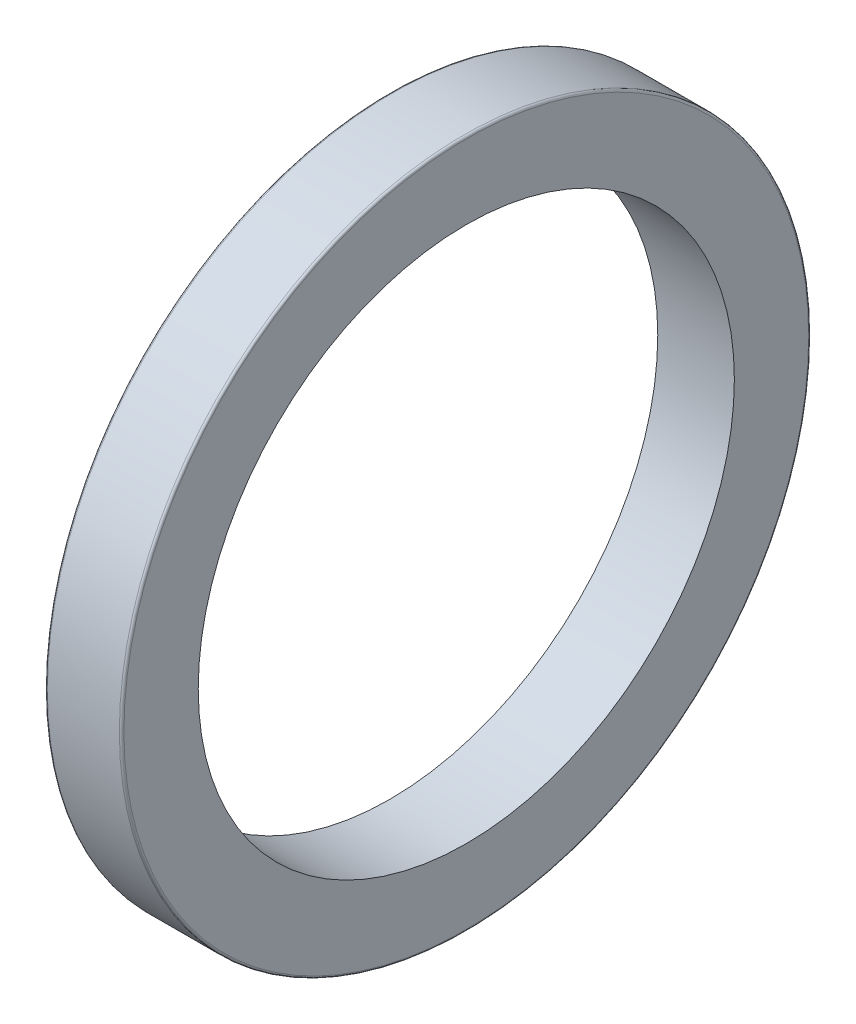
ISO-10303-21;
HEADER;
FILE_DESCRIPTION(('STEP AP214'),'2;1');
FILE_NAME('part.step','',(''),(''),'','','');
FILE_SCHEMA(('AUTOMOTIVE_DESIGN { 1 0 10303 214 1 1 1 1 }'));
ENDSEC;
DATA;
#1=APPLICATION_CONTEXT('core data for automotive mechanical design processes');
#2=APPLICATION_PROTOCOL_DEFINITION('international standard','automotive_design',2000,#1);
#3=PRODUCT_CONTEXT('',#1,'mechanical');
#4=PRODUCT('Part','Part','',(#3));
#5=PRODUCT_RELATED_PRODUCT_CATEGORY('part','',(#4));
#6=PRODUCT_DEFINITION_FORMATION('','',#4);
#7=PRODUCT_DEFINITION_CONTEXT('part definition',#1,'design');
#8=PRODUCT_DEFINITION('design','',#6,#7);
#9=PRODUCT_DEFINITION_SHAPE('','',#8);
#10=(LENGTH_UNIT() NAMED_UNIT(*) SI_UNIT(.MILLI.,.METRE.));
#11=(NAMED_UNIT(*) PLANE_ANGLE_UNIT() SI_UNIT($,.RADIAN.));
#12=(NAMED_UNIT(*) SI_UNIT($,.STERADIAN.) SOLID_ANGLE_UNIT());
#13=UNCERTAINTY_MEASURE_WITH_UNIT(LENGTH_MEASURE(1.E-05),#10,'distance_accuracy_value','');
#14=(GEOMETRIC_REPRESENTATION_CONTEXT(3) GLOBAL_UNCERTAINTY_ASSIGNED_CONTEXT((#13)) GLOBAL_UNIT_ASSIGNED_CONTEXT((#10,
#11,#12)) REPRESENTATION_CONTEXT('',''));
#15=CARTESIAN_POINT('',(0.,0.,0.));
#16=DIRECTION('',(0.,0.,1.));
#17=DIRECTION('',(1.,0.,0.));
#18=AXIS2_PLACEMENT_3D('',#15,#16,#17);
#19=CARTESIAN_POINT('',(9.7,0.,0.));
#20=DIRECTION('',(-1.,0.,0.));
#21=DIRECTION('',(0.,0.,1.));
#22=AXIS2_PLACEMENT_3D('',#19,#20,#21);
#23=TOROIDAL_SURFACE('',#22,44.7,0.300000000000004);
#24=CARTESIAN_POINT('',(10.,0.,0.));
#25=DIRECTION('',(-1.,0.,0.));
#26=DIRECTION('',(0.,0.,1.));
#27=AXIS2_PLACEMENT_3D('',#24,#25,#26);
#28=CIRCLE('',#27,44.7);
#29=CARTESIAN_POINT('',(10.,0.,-44.7));
#30=VERTEX_POINT('',#29);
#31=EDGE_CURVE('E11',#30,#30,#28,.T.);
#32=ORIENTED_EDGE('',*,*,#31,.T.);
#33=EDGE_LOOP('',(#32));
#34=FACE_BOUND('',#33,.T.);
#35=CARTESIAN_POINT('',(9.7,0.,0.));
#36=DIRECTION('',(1.,0.,0.));
#37=DIRECTION('',(0.,0.,1.));
#38=AXIS2_PLACEMENT_3D('',#35,#36,#37);
#39=CIRCLE('',#38,45.);
#40=CARTESIAN_POINT('',(9.7,0.,-45.));
#41=VERTEX_POINT('',#40);
#42=EDGE_CURVE('E28',#41,#41,#39,.T.);
#43=ORIENTED_EDGE('',*,*,#42,.T.);
#44=EDGE_LOOP('',(#43));
#45=FACE_BOUND('',#44,.T.);
#46=ADVANCED_FACE('F17',(#34,#45),#23,.T.);
#47=CARTESIAN_POINT('',(5.,0.,0.));
#48=DIRECTION('',(1.,0.,0.));
#49=DIRECTION('',(0.,0.,1.));
#50=AXIS2_PLACEMENT_3D('',#47,#48,#49);
#51=CYLINDRICAL_SURFACE('',#50,45.);
#52=CARTESIAN_POINT('',(0.29999999999999,0.,0.));
#53=DIRECTION('',(-1.,0.,0.));
#54=DIRECTION('',(0.,0.,1.));
#55=AXIS2_PLACEMENT_3D('',#52,#53,#54);
#56=CIRCLE('',#55,45.);
#57=CARTESIAN_POINT('',(0.29999999999999,0.,-45.));
#58=VERTEX_POINT('',#57);
#59=EDGE_CURVE('E46',#58,#58,#56,.T.);
#60=ORIENTED_EDGE('',*,*,#59,.F.);
#61=EDGE_LOOP('',(#60));
#62=FACE_BOUND('',#61,.T.);
#63=ORIENTED_EDGE('',*,*,#42,.F.);
#64=EDGE_LOOP('',(#63));
#65=FACE_BOUND('',#64,.T.);
#66=ADVANCED_FACE('F47',(#62,#65),#51,.T.);
#67=CARTESIAN_POINT('',(10.,0.,37.5));
#68=DIRECTION('',(1.,0.,0.));
#69=DIRECTION('',(0.,1.,0.));
#70=AXIS2_PLACEMENT_3D('',#67,#68,#69);
#71=PLANE('',#70);
#72=CARTESIAN_POINT('',(10.,0.,0.));
#73=DIRECTION('',(-1.,0.,0.));
#74=DIRECTION('',(0.,0.,1.));
#75=AXIS2_PLACEMENT_3D('',#72,#73,#74);
#76=CIRCLE('',#75,35.);
#77=CARTESIAN_POINT('',(10.,0.,-35.));
#78=VERTEX_POINT('',#77);
#79=EDGE_CURVE('E21',#78,#78,#76,.T.);
#80=ORIENTED_EDGE('',*,*,#79,.T.);
#81=EDGE_LOOP('',(#80));
#82=FACE_BOUND('',#81,.T.);
#83=ORIENTED_EDGE('',*,*,#31,.F.);
#84=EDGE_LOOP('',(#83));
#85=FACE_BOUND('',#84,.T.);
#86=ADVANCED_FACE('F19',(#82,#85),#71,.T.);
#87=CARTESIAN_POINT('',(0.29999999999999,0.,0.));
#88=DIRECTION('',(-1.,0.,0.));
#89=DIRECTION('',(0.,0.,1.));
#90=AXIS2_PLACEMENT_3D('',#87,#88,#89);
#91=TOROIDAL_SURFACE('',#90,44.7,0.29999999999999);
#92=ORIENTED_EDGE('',*,*,#59,.T.);
#93=EDGE_LOOP('',(#92));
#94=FACE_BOUND('',#93,.T.);
#95=CARTESIAN_POINT('',(0.,0.,0.));
#96=DIRECTION('',(1.,0.,0.));
#97=DIRECTION('',(0.,0.,1.));
#98=AXIS2_PLACEMENT_3D('',#95,#96,#97);
#99=CIRCLE('',#98,44.7);
#100=CARTESIAN_POINT('',(0.,0.,-44.7));
#101=VERTEX_POINT('',#100);
#102=EDGE_CURVE('E51',#101,#101,#99,.T.);
#103=ORIENTED_EDGE('',*,*,#102,.T.);
#104=EDGE_LOOP('',(#103));
#105=FACE_BOUND('',#104,.T.);
#106=ADVANCED_FACE('F75',(#94,#105),#91,.T.);
#107=CARTESIAN_POINT('',(0.,0.,37.5));
#108=DIRECTION('',(-1.,0.,0.));
#109=DIRECTION('',(0.,0.,1.));
#110=AXIS2_PLACEMENT_3D('',#107,#108,#109);
#111=PLANE('',#110);
#112=CARTESIAN_POINT('',(0.,0.,0.));
#113=DIRECTION('',(-1.,0.,0.));
#114=DIRECTION('',(0.,0.,1.));
#115=AXIS2_PLACEMENT_3D('',#112,#113,#114);
#116=CIRCLE('',#115,35.);
#117=CARTESIAN_POINT('',(0.,0.,-35.));
#118=VERTEX_POINT('',#117);
#119=EDGE_CURVE('E60',#118,#118,#116,.T.);
#120=ORIENTED_EDGE('',*,*,#119,.F.);
#121=EDGE_LOOP('',(#120));
#122=FACE_BOUND('',#121,.T.);
#123=ORIENTED_EDGE('',*,*,#102,.F.);
#124=EDGE_LOOP('',(#123));
#125=FACE_BOUND('',#124,.T.);
#126=ADVANCED_FACE('F82',(#122,#125),#111,.T.);
#127=CARTESIAN_POINT('',(9.6,0.,0.));
#128=DIRECTION('',(1.,0.,0.));
#129=DIRECTION('',(0.,0.,1.));
#130=AXIS2_PLACEMENT_3D('',#127,#128,#129);
#131=CYLINDRICAL_SURFACE('',#130,35.);
#132=ORIENTED_EDGE('',*,*,#79,.F.);
#133=EDGE_LOOP('',(#132));
#134=FACE_BOUND('',#133,.T.);
#135=ORIENTED_EDGE('',*,*,#119,.T.);
#136=EDGE_LOOP('',(#135));
#137=FACE_BOUND('',#136,.T.);
#138=ADVANCED_FACE('F84',(#134,#137),#131,.F.);
#139=CLOSED_SHELL('',(#46,#66,#86,#106,#126,#138));
#140=MANIFOLD_SOLID_BREP('B1',#139);
#141=ADVANCED_BREP_SHAPE_REPRESENTATION('',(#18,#140),#14);
#142=SHAPE_DEFINITION_REPRESENTATION(#9,#141);
ENDSEC;
END-ISO-10303-21;
